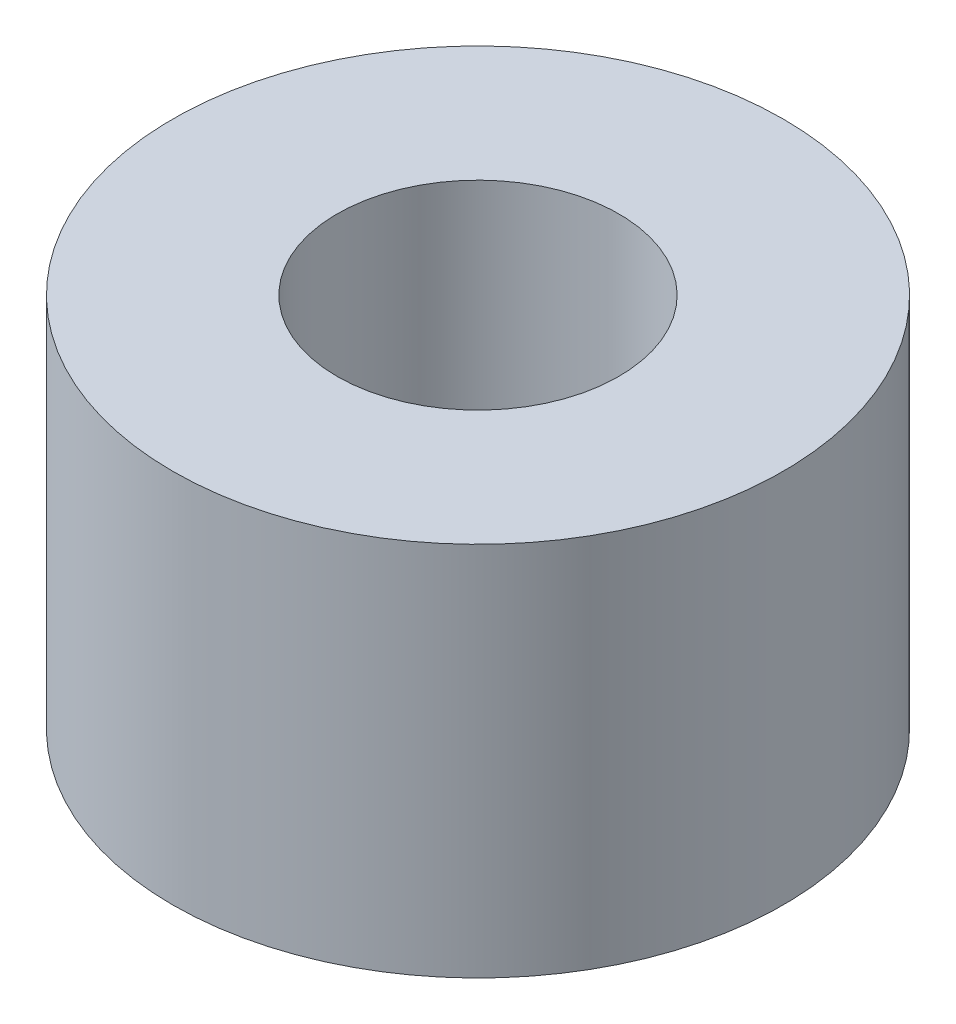
ISO-10303-21;
HEADER;
FILE_DESCRIPTION(('STEP AP214'),'2;1');
FILE_NAME('part.step','',(''),(''),'','','');
FILE_SCHEMA(('AUTOMOTIVE_DESIGN { 1 0 10303 214 1 1 1 1 }'));
ENDSEC;
DATA;
#1=APPLICATION_CONTEXT('core data for automotive mechanical design processes');
#2=APPLICATION_PROTOCOL_DEFINITION('international standard','automotive_design',2000,#1);
#3=PRODUCT_CONTEXT('',#1,'mechanical');
#4=PRODUCT('Part','Part','',(#3));
#5=PRODUCT_RELATED_PRODUCT_CATEGORY('part','',(#4));
#6=PRODUCT_DEFINITION_FORMATION('','',#4);
#7=PRODUCT_DEFINITION_CONTEXT('part definition',#1,'design');
#8=PRODUCT_DEFINITION('design','',#6,#7);
#9=PRODUCT_DEFINITION_SHAPE('','',#8);
#10=(LENGTH_UNIT() NAMED_UNIT(*) SI_UNIT(.MILLI.,.METRE.));
#11=(NAMED_UNIT(*) PLANE_ANGLE_UNIT() SI_UNIT($,.RADIAN.));
#12=(NAMED_UNIT(*) SI_UNIT($,.STERADIAN.) SOLID_ANGLE_UNIT());
#13=UNCERTAINTY_MEASURE_WITH_UNIT(LENGTH_MEASURE(1.E-05),#10,'distance_accuracy_value','');
#14=(GEOMETRIC_REPRESENTATION_CONTEXT(3) GLOBAL_UNCERTAINTY_ASSIGNED_CONTEXT((#13)) GLOBAL_UNIT_ASSIGNED_CONTEXT((#10,
#11,#12)) REPRESENTATION_CONTEXT('',''));
#15=CARTESIAN_POINT('',(0.,0.,0.));
#16=DIRECTION('',(0.,0.,1.));
#17=DIRECTION('',(1.,0.,0.));
#18=AXIS2_PLACEMENT_3D('',#15,#16,#17);
#19=CARTESIAN_POINT('',(0.,4.,0.));
#20=DIRECTION('',(0.,-1.,0.));
#21=DIRECTION('',(0.,0.,-1.));
#22=AXIS2_PLACEMENT_3D('',#19,#20,#21);
#23=CYLINDRICAL_SURFACE('',#22,3.25);
#24=CARTESIAN_POINT('',(0.,4.,0.));
#25=DIRECTION('',(0.,1.,0.));
#26=DIRECTION('',(0.,0.,1.));
#27=AXIS2_PLACEMENT_3D('',#24,#25,#26);
#28=CIRCLE('',#27,3.25);
#29=CARTESIAN_POINT('',(0.,4.,3.25));
#30=VERTEX_POINT('',#29);
#31=EDGE_CURVE('E10',#30,#30,#28,.T.);
#32=ORIENTED_EDGE('',*,*,#31,.F.);
#33=EDGE_LOOP('',(#32));
#34=FACE_BOUND('',#33,.T.);
#35=CARTESIAN_POINT('',(0.,0.,0.));
#36=DIRECTION('',(0.,1.,0.));
#37=DIRECTION('',(0.,0.,1.));
#38=AXIS2_PLACEMENT_3D('',#35,#36,#37);
#39=CIRCLE('',#38,3.25);
#40=CARTESIAN_POINT('',(0.,0.,3.25));
#41=VERTEX_POINT('',#40);
#42=EDGE_CURVE('E40',#41,#41,#39,.T.);
#43=ORIENTED_EDGE('',*,*,#42,.T.);
#44=EDGE_LOOP('',(#43));
#45=FACE_BOUND('',#44,.T.);
#46=ADVANCED_FACE('F37',(#34,#45),#23,.T.);
#47=CARTESIAN_POINT('',(0.,4.,0.));
#48=DIRECTION('',(0.,1.,0.));
#49=DIRECTION('',(0.,0.,1.));
#50=AXIS2_PLACEMENT_3D('',#47,#48,#49);
#51=PLANE('',#50);
#52=CARTESIAN_POINT('',(0.,4.,0.));
#53=DIRECTION('',(0.,1.,0.));
#54=DIRECTION('',(0.,0.,1.));
#55=AXIS2_PLACEMENT_3D('',#52,#53,#54);
#56=CIRCLE('',#55,1.5);
#57=CARTESIAN_POINT('',(0.,4.,1.5));
#58=VERTEX_POINT('',#57);
#59=EDGE_CURVE('E49',#58,#58,#56,.F.);
#60=ORIENTED_EDGE('',*,*,#59,.T.);
#61=EDGE_LOOP('',(#60));
#62=FACE_BOUND('',#61,.T.);
#63=ORIENTED_EDGE('',*,*,#31,.T.);
#64=EDGE_LOOP('',(#63));
#65=FACE_BOUND('',#64,.T.);
#66=ADVANCED_FACE('F69',(#62,#65),#51,.T.);
#67=CARTESIAN_POINT('',(0.,0.,0.));
#68=DIRECTION('',(0.,1.,0.));
#69=DIRECTION('',(0.,0.,1.));
#70=AXIS2_PLACEMENT_3D('',#67,#68,#69);
#71=PLANE('',#70);
#72=CARTESIAN_POINT('',(0.,0.,0.));
#73=DIRECTION('',(0.,1.,0.));
#74=DIRECTION('',(0.,0.,1.));
#75=AXIS2_PLACEMENT_3D('',#72,#73,#74);
#76=CIRCLE('',#75,1.5);
#77=CARTESIAN_POINT('',(0.,0.,1.5));
#78=VERTEX_POINT('',#77);
#79=EDGE_CURVE('E54',#78,#78,#76,.T.);
#80=ORIENTED_EDGE('',*,*,#79,.T.);
#81=EDGE_LOOP('',(#80));
#82=FACE_BOUND('',#81,.T.);
#83=ORIENTED_EDGE('',*,*,#42,.F.);
#84=EDGE_LOOP('',(#83));
#85=FACE_BOUND('',#84,.T.);
#86=ADVANCED_FACE('F59',(#82,#85),#71,.F.);
#87=CARTESIAN_POINT('',(0.,28.,0.));
#88=DIRECTION('',(0.,-1.,0.));
#89=DIRECTION('',(0.,0.,-1.));
#90=AXIS2_PLACEMENT_3D('',#87,#88,#89);
#91=CYLINDRICAL_SURFACE('',#90,1.5);
#92=ORIENTED_EDGE('',*,*,#59,.F.);
#93=EDGE_LOOP('',(#92));
#94=FACE_BOUND('',#93,.T.);
#95=ORIENTED_EDGE('',*,*,#79,.F.);
#96=EDGE_LOOP('',(#95));
#97=FACE_BOUND('',#96,.T.);
#98=ADVANCED_FACE('F62',(#94,#97),#91,.F.);
#99=CLOSED_SHELL('',(#46,#66,#86,#98));
#100=MANIFOLD_SOLID_BREP('B2',#99);
#101=ADVANCED_BREP_SHAPE_REPRESENTATION('',(#18,#100),#14);
#102=SHAPE_DEFINITION_REPRESENTATION(#9,#101);
ENDSEC;
END-ISO-10303-21;
